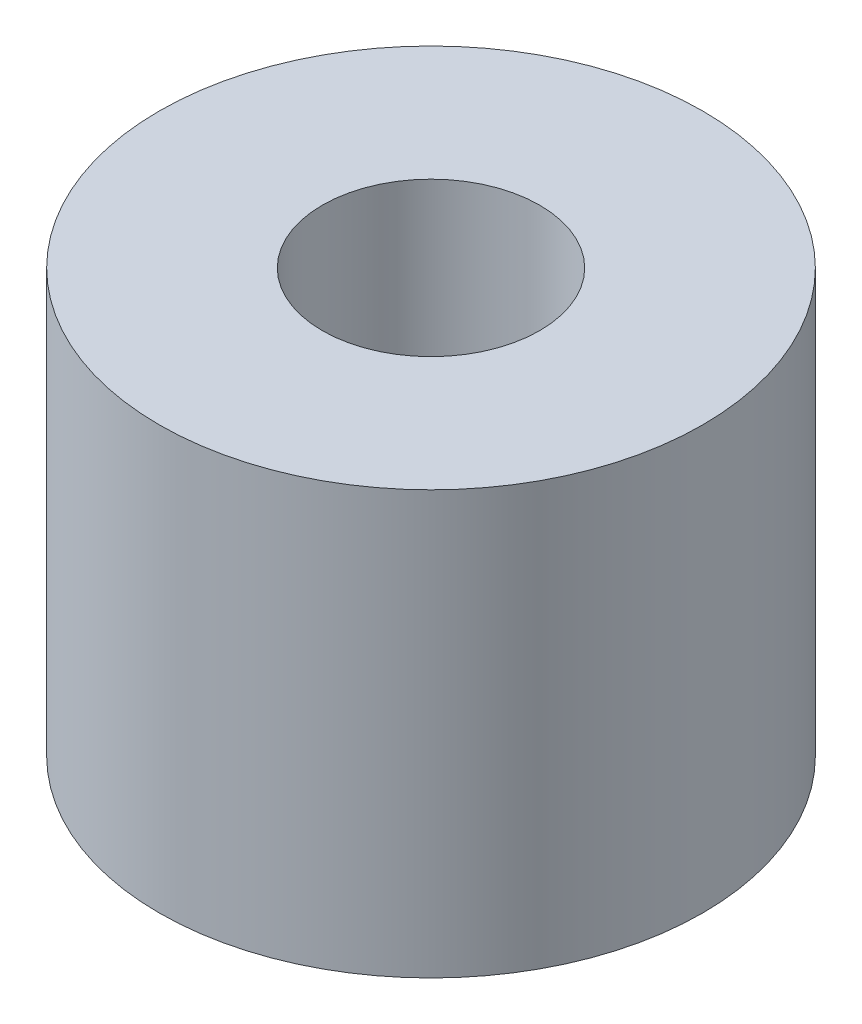
ISO-10303-21;
HEADER;
FILE_DESCRIPTION(('STEP AP214'),'2;1');
FILE_NAME('part.step','',(''),(''),'','','');
FILE_SCHEMA(('AUTOMOTIVE_DESIGN { 1 0 10303 214 1 1 1 1 }'));
ENDSEC;
DATA;
#1=APPLICATION_CONTEXT('core data for automotive mechanical design processes');
#2=APPLICATION_PROTOCOL_DEFINITION('international standard','automotive_design',2000,#1);
#3=PRODUCT_CONTEXT('',#1,'mechanical');
#4=PRODUCT('Part','Part','',(#3));
#5=PRODUCT_RELATED_PRODUCT_CATEGORY('part','',(#4));
#6=PRODUCT_DEFINITION_FORMATION('','',#4);
#7=PRODUCT_DEFINITION_CONTEXT('part definition',#1,'design');
#8=PRODUCT_DEFINITION('design','',#6,#7);
#9=PRODUCT_DEFINITION_SHAPE('','',#8);
#10=(LENGTH_UNIT() NAMED_UNIT(*) SI_UNIT(.MILLI.,.METRE.));
#11=(NAMED_UNIT(*) PLANE_ANGLE_UNIT() SI_UNIT($,.RADIAN.));
#12=(NAMED_UNIT(*) SI_UNIT($,.STERADIAN.) SOLID_ANGLE_UNIT());
#13=UNCERTAINTY_MEASURE_WITH_UNIT(LENGTH_MEASURE(1.E-05),#10,'distance_accuracy_value','');
#14=(GEOMETRIC_REPRESENTATION_CONTEXT(3) GLOBAL_UNCERTAINTY_ASSIGNED_CONTEXT((#13)) GLOBAL_UNIT_ASSIGNED_CONTEXT((#10,
#11,#12)) REPRESENTATION_CONTEXT('',''));
#15=CARTESIAN_POINT('',(0.,0.,0.));
#16=DIRECTION('',(0.,0.,1.));
#17=DIRECTION('',(1.,0.,0.));
#18=AXIS2_PLACEMENT_3D('',#15,#16,#17);
#19=CARTESIAN_POINT('',(0.,7.,0.));
#20=DIRECTION('',(0.,1.,0.));
#21=DIRECTION('',(0.,0.,1.));
#22=AXIS2_PLACEMENT_3D('',#19,#20,#21);
#23=PLANE('',#22);
#24=CARTESIAN_POINT('',(0.,7.,0.));
#25=DIRECTION('',(0.,1.,0.));
#26=DIRECTION('',(0.,0.,1.));
#27=AXIS2_PLACEMENT_3D('',#24,#25,#26);
#28=CIRCLE('',#27,4.5);
#29=CARTESIAN_POINT('',(0.,7.,4.5));
#30=VERTEX_POINT('',#29);
#31=EDGE_CURVE('E10',#30,#30,#28,.T.);
#32=ORIENTED_EDGE('',*,*,#31,.T.);
#33=EDGE_LOOP('',(#32));
#34=FACE_BOUND('',#33,.T.);
#35=CARTESIAN_POINT('',(0.,7.,0.));
#36=DIRECTION('',(0.,1.,0.));
#37=DIRECTION('',(0.,0.,1.));
#38=AXIS2_PLACEMENT_3D('',#35,#36,#37);
#39=CIRCLE('',#38,1.8);
#40=CARTESIAN_POINT('',(0.,7.,1.8));
#41=VERTEX_POINT('',#40);
#42=EDGE_CURVE('E43',#41,#41,#39,.T.);
#43=ORIENTED_EDGE('',*,*,#42,.F.);
#44=EDGE_LOOP('',(#43));
#45=FACE_BOUND('',#44,.T.);
#46=ADVANCED_FACE('F32',(#34,#45),#23,.T.);
#47=CARTESIAN_POINT('',(0.,0.,0.));
#48=DIRECTION('',(0.,1.,0.));
#49=DIRECTION('',(0.,0.,1.));
#50=AXIS2_PLACEMENT_3D('',#47,#48,#49);
#51=PLANE('',#50);
#52=CARTESIAN_POINT('',(0.,0.,0.));
#53=DIRECTION('',(0.,1.,0.));
#54=DIRECTION('',(0.,0.,1.));
#55=AXIS2_PLACEMENT_3D('',#52,#53,#54);
#56=CIRCLE('',#55,4.5);
#57=CARTESIAN_POINT('',(0.,0.,4.5));
#58=VERTEX_POINT('',#57);
#59=EDGE_CURVE('E36',#58,#58,#56,.T.);
#60=ORIENTED_EDGE('',*,*,#59,.F.);
#61=EDGE_LOOP('',(#60));
#62=FACE_BOUND('',#61,.T.);
#63=CARTESIAN_POINT('',(0.,0.,0.));
#64=DIRECTION('',(0.,1.,0.));
#65=DIRECTION('',(0.,0.,1.));
#66=AXIS2_PLACEMENT_3D('',#63,#64,#65);
#67=CIRCLE('',#66,1.8);
#68=CARTESIAN_POINT('',(0.,0.,1.8));
#69=VERTEX_POINT('',#68);
#70=EDGE_CURVE('E45',#69,#69,#67,.T.);
#71=ORIENTED_EDGE('',*,*,#70,.T.);
#72=EDGE_LOOP('',(#71));
#73=FACE_BOUND('',#72,.T.);
#74=ADVANCED_FACE('F55',(#62,#73),#51,.F.);
#75=CARTESIAN_POINT('',(0.,7.,0.));
#76=DIRECTION('',(0.,-1.,0.));
#77=DIRECTION('',(0.,0.,-1.));
#78=AXIS2_PLACEMENT_3D('',#75,#76,#77);
#79=CYLINDRICAL_SURFACE('',#78,4.5);
#80=ORIENTED_EDGE('',*,*,#31,.F.);
#81=EDGE_LOOP('',(#80));
#82=FACE_BOUND('',#81,.T.);
#83=ORIENTED_EDGE('',*,*,#59,.T.);
#84=EDGE_LOOP('',(#83));
#85=FACE_BOUND('',#84,.T.);
#86=ADVANCED_FACE('F34',(#82,#85),#79,.T.);
#87=CARTESIAN_POINT('',(0.,7.,0.));
#88=DIRECTION('',(0.,-1.,0.));
#89=DIRECTION('',(0.,0.,-1.));
#90=AXIS2_PLACEMENT_3D('',#87,#88,#89);
#91=CYLINDRICAL_SURFACE('',#90,1.8);
#92=ORIENTED_EDGE('',*,*,#42,.T.);
#93=EDGE_LOOP('',(#92));
#94=FACE_BOUND('',#93,.T.);
#95=ORIENTED_EDGE('',*,*,#70,.F.);
#96=EDGE_LOOP('',(#95));
#97=FACE_BOUND('',#96,.T.);
#98=ADVANCED_FACE('F51',(#94,#97),#91,.F.);
#99=CLOSED_SHELL('',(#46,#74,#86,#98));
#100=MANIFOLD_SOLID_BREP('B2',#99);
#101=ADVANCED_BREP_SHAPE_REPRESENTATION('',(#18,#100),#14);
#102=SHAPE_DEFINITION_REPRESENTATION(#9,#101);
ENDSEC;
END-ISO-10303-21;
